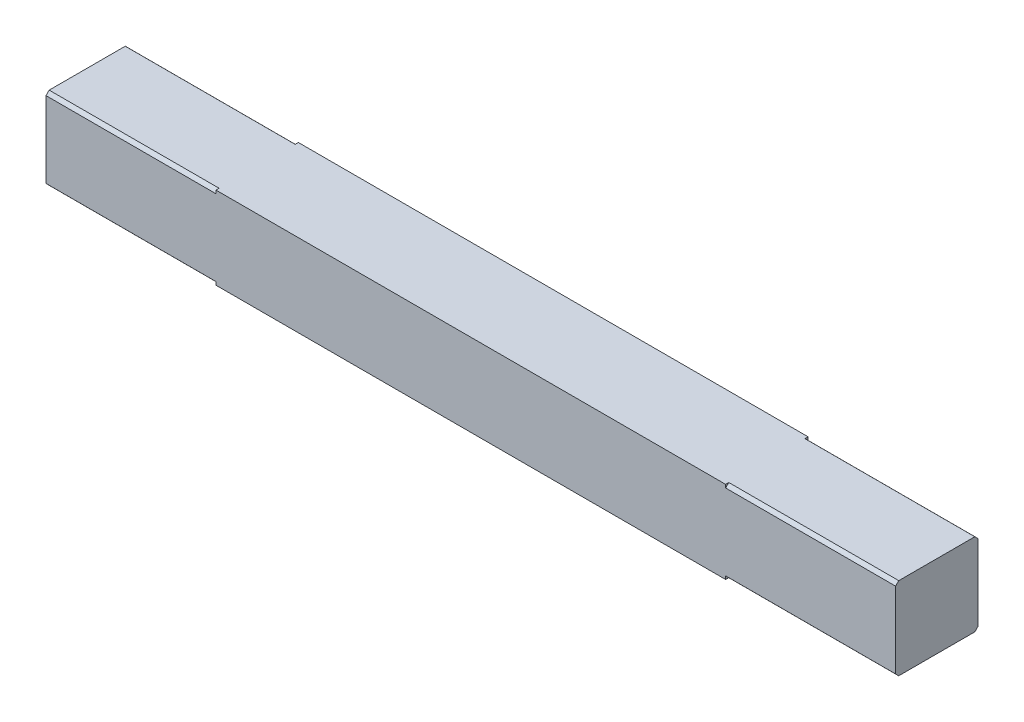
ISO-10303-21;
HEADER;
FILE_DESCRIPTION(('STEP AP214'),'2;1');
FILE_NAME('part.step','',(''),(''),'','','');
FILE_SCHEMA(('AUTOMOTIVE_DESIGN { 1 0 10303 214 1 1 1 1 }'));
ENDSEC;
DATA;
#1=APPLICATION_CONTEXT('core data for automotive mechanical design processes');
#2=APPLICATION_PROTOCOL_DEFINITION('international standard','automotive_design',2000,#1);
#3=PRODUCT_CONTEXT('',#1,'mechanical');
#4=PRODUCT('Part','Part','',(#3));
#5=PRODUCT_RELATED_PRODUCT_CATEGORY('part','',(#4));
#6=PRODUCT_DEFINITION_FORMATION('','',#4);
#7=PRODUCT_DEFINITION_CONTEXT('part definition',#1,'design');
#8=PRODUCT_DEFINITION('design','',#6,#7);
#9=PRODUCT_DEFINITION_SHAPE('','',#8);
#10=(LENGTH_UNIT() NAMED_UNIT(*) SI_UNIT(.MILLI.,.METRE.));
#11=(NAMED_UNIT(*) PLANE_ANGLE_UNIT() SI_UNIT($,.RADIAN.));
#12=(NAMED_UNIT(*) SI_UNIT($,.STERADIAN.) SOLID_ANGLE_UNIT());
#13=UNCERTAINTY_MEASURE_WITH_UNIT(LENGTH_MEASURE(1.E-05),#10,'distance_accuracy_value','');
#14=(GEOMETRIC_REPRESENTATION_CONTEXT(3) GLOBAL_UNCERTAINTY_ASSIGNED_CONTEXT((#13)) GLOBAL_UNIT_ASSIGNED_CONTEXT((#10,
#11,#12)) REPRESENTATION_CONTEXT('',''));
#15=CARTESIAN_POINT('',(0.,0.,0.));
#16=DIRECTION('',(0.,0.,1.));
#17=DIRECTION('',(1.,0.,0.));
#18=AXIS2_PLACEMENT_3D('',#15,#16,#17);
#19=CARTESIAN_POINT('',(36.4593022886911,1.27813370473538,4.85));
#20=DIRECTION('',(0.,1.,0.));
#21=DIRECTION('',(-1.,0.,0.));
#22=AXIS2_PLACEMENT_3D('',#19,#20,#21);
#23=PLANE('',#22);
#24=DIRECTION('',(0.,0.,-1.));
#25=VECTOR('',#24,1.);
#26=CARTESIAN_POINT('',(26.4593022886911,1.27813370473538,4.85));
#27=LINE('',#26,#25);
#28=CARTESIAN_POINT('',(26.4593022886911,1.27813370473538,4.85));
#29=VERTEX_POINT('',#28);
#30=CARTESIAN_POINT('',(26.4593022886911,1.27813370473538,4.66316330950179));
#31=VERTEX_POINT('',#30);
#32=EDGE_CURVE('E297',#29,#31,#27,.T.);
#33=ORIENTED_EDGE('',*,*,#32,.F.);
#34=DIRECTION('',(1.,0.,0.));
#35=VECTOR('',#34,1.);
#36=CARTESIAN_POINT('',(36.4593022886911,1.27813370473538,4.85));
#37=LINE('',#36,#35);
#38=CARTESIAN_POINT('',(-3.54069771130893,1.27813370473538,4.85));
#39=VERTEX_POINT('',#38);
#40=EDGE_CURVE('E208',#39,#29,#37,.T.);
#41=ORIENTED_EDGE('',*,*,#40,.F.);
#42=DIRECTION('',(0.,0.,1.));
#43=VECTOR('',#42,1.);
#44=CARTESIAN_POINT('',(-3.54069771130893,1.27813370473538,4.85));
#45=LINE('',#44,#43);
#46=CARTESIAN_POINT('',(-3.54069771130893,1.27813370473538,4.66316330950179));
#47=VERTEX_POINT('',#46);
#48=EDGE_CURVE('E256',#47,#39,#45,.T.);
#49=ORIENTED_EDGE('',*,*,#48,.F.);
#50=DIRECTION('',(-1.,0.,0.));
#51=VECTOR('',#50,1.);
#52=CARTESIAN_POINT('',(-3.54069771130893,1.27813370473538,4.66316330950179));
#53=LINE('',#52,#51);
#54=CARTESIAN_POINT('',(-13.5406977113089,1.27813370473538,4.66316330950179));
#55=VERTEX_POINT('',#54);
#56=EDGE_CURVE('E275',#55,#47,#53,.F.);
#57=ORIENTED_EDGE('',*,*,#56,.F.);
#58=DIRECTION('',(0.,0.,-1.));
#59=VECTOR('',#58,1.);
#60=CARTESIAN_POINT('',(-13.5406977113089,1.27813370473538,4.85));
#61=LINE('',#60,#59);
#62=CARTESIAN_POINT('',(-13.5406977113089,1.27813370473538,0.186836690498209));
#63=VERTEX_POINT('',#62);
#64=EDGE_CURVE('E224',#55,#63,#61,.T.);
#65=ORIENTED_EDGE('',*,*,#64,.T.);
#66=DIRECTION('',(-1.,0.,0.));
#67=VECTOR('',#66,1.);
#68=CARTESIAN_POINT('',(-3.54069771130893,1.27813370473538,0.186836690498209));
#69=LINE('',#68,#67);
#70=CARTESIAN_POINT('',(-3.54069771130893,1.27813370473538,0.186836690498209));
#71=VERTEX_POINT('',#70);
#72=EDGE_CURVE('E273',#71,#63,#69,.T.);
#73=ORIENTED_EDGE('',*,*,#72,.F.);
#74=CARTESIAN_POINT('',(-3.54069771130893,1.27813370473538,0.));
#75=VERTEX_POINT('',#74);
#76=EDGE_CURVE('E253',#75,#71,#45,.T.);
#77=ORIENTED_EDGE('',*,*,#76,.F.);
#78=DIRECTION('',(1.,0.,0.));
#79=VECTOR('',#78,1.);
#80=CARTESIAN_POINT('',(36.4593022886911,1.27813370473538,0.));
#81=LINE('',#80,#79);
#82=CARTESIAN_POINT('',(26.4593022886911,1.27813370473538,0.));
#83=VERTEX_POINT('',#82);
#84=EDGE_CURVE('E210',#75,#83,#81,.T.);
#85=ORIENTED_EDGE('',*,*,#84,.T.);
#86=CARTESIAN_POINT('',(26.4593022886911,1.27813370473538,0.186836690498212));
#87=VERTEX_POINT('',#86);
#88=EDGE_CURVE('E251',#87,#83,#27,.T.);
#89=ORIENTED_EDGE('',*,*,#88,.F.);
#90=DIRECTION('',(1.,0.,0.));
#91=VECTOR('',#90,1.);
#92=CARTESIAN_POINT('',(26.4593022886911,1.27813370473538,0.186836690498212));
#93=LINE('',#92,#91);
#94=CARTESIAN_POINT('',(36.4593022886911,1.27813370473538,0.18683669049821));
#95=VERTEX_POINT('',#94);
#96=EDGE_CURVE('E303',#95,#87,#93,.F.);
#97=ORIENTED_EDGE('',*,*,#96,.F.);
#98=DIRECTION('',(0.,0.,-1.));
#99=VECTOR('',#98,1.);
#100=CARTESIAN_POINT('',(36.4593022886911,1.27813370473538,4.85));
#101=LINE('',#100,#99);
#102=CARTESIAN_POINT('',(36.4593022886911,1.27813370473538,4.66316330950179));
#103=VERTEX_POINT('',#102);
#104=EDGE_CURVE('E221',#103,#95,#101,.T.);
#105=ORIENTED_EDGE('',*,*,#104,.F.);
#106=DIRECTION('',(1.,0.,0.));
#107=VECTOR('',#106,1.);
#108=CARTESIAN_POINT('',(26.4593022886911,1.27813370473538,4.66316330950179));
#109=LINE('',#108,#107);
#110=EDGE_CURVE('E50',#31,#103,#109,.T.);
#111=ORIENTED_EDGE('',*,*,#110,.F.);
#112=EDGE_LOOP('',(#33,#41,#49,#57,#65,#73,#77,#85,#89,#97,#105,#111));
#113=FACE_BOUND('',#112,.T.);
#114=ADVANCED_FACE('F35',(#113),#23,.F.);
#115=CARTESIAN_POINT('',(36.4593022886911,6.12813370473538,4.85));
#116=DIRECTION('',(0.,-1.,0.));
#117=DIRECTION('',(1.,0.,0.));
#118=AXIS2_PLACEMENT_3D('',#115,#116,#117);
#119=PLANE('',#118);
#120=DIRECTION('',(0.,0.,1.));
#121=VECTOR('',#120,1.);
#122=CARTESIAN_POINT('',(26.4593022886911,6.12813370473538,4.85));
#123=LINE('',#122,#121);
#124=CARTESIAN_POINT('',(26.4593022886911,6.12813370473538,0.));
#125=VERTEX_POINT('',#124);
#126=CARTESIAN_POINT('',(26.4593022886911,6.12813370473538,0.186836690498207));
#127=VERTEX_POINT('',#126);
#128=EDGE_CURVE('E190',#125,#127,#123,.T.);
#129=ORIENTED_EDGE('',*,*,#128,.F.);
#130=DIRECTION('',(-1.,0.,0.));
#131=VECTOR('',#130,1.);
#132=CARTESIAN_POINT('',(36.4593022886911,6.12813370473538,0.));
#133=LINE('',#132,#131);
#134=CARTESIAN_POINT('',(-3.54069771130893,6.12813370473538,0.));
#135=VERTEX_POINT('',#134);
#136=EDGE_CURVE('E197',#125,#135,#133,.T.);
#137=ORIENTED_EDGE('',*,*,#136,.T.);
#138=DIRECTION('',(0.,0.,-1.));
#139=VECTOR('',#138,1.);
#140=CARTESIAN_POINT('',(-3.54069771130893,6.12813370473538,4.85));
#141=LINE('',#140,#139);
#142=CARTESIAN_POINT('',(-3.54069771130893,6.12813370473538,0.186836690498212));
#143=VERTEX_POINT('',#142);
#144=EDGE_CURVE('E271',#143,#135,#141,.T.);
#145=ORIENTED_EDGE('',*,*,#144,.F.);
#146=DIRECTION('',(-1.,0.,0.));
#147=VECTOR('',#146,1.);
#148=CARTESIAN_POINT('',(-3.54069771130893,6.12813370473538,0.186836690498212));
#149=LINE('',#148,#147);
#150=CARTESIAN_POINT('',(-13.5406977113089,6.12813370473538,0.186836690498212));
#151=VERTEX_POINT('',#150);
#152=EDGE_CURVE('E279',#151,#143,#149,.F.);
#153=ORIENTED_EDGE('',*,*,#152,.F.);
#154=DIRECTION('',(0.,0.,-1.));
#155=VECTOR('',#154,1.);
#156=CARTESIAN_POINT('',(-13.5406977113089,6.12813370473538,4.85));
#157=LINE('',#156,#155);
#158=CARTESIAN_POINT('',(-13.5406977113089,6.12813370473538,4.66316330950179));
#159=VERTEX_POINT('',#158);
#160=EDGE_CURVE('E214',#159,#151,#157,.T.);
#161=ORIENTED_EDGE('',*,*,#160,.F.);
#162=DIRECTION('',(-1.,0.,0.));
#163=VECTOR('',#162,1.);
#164=CARTESIAN_POINT('',(-3.54069771130893,6.12813370473538,4.66316330950179));
#165=LINE('',#164,#163);
#166=CARTESIAN_POINT('',(-3.54069771130893,6.12813370473538,4.66316330950179));
#167=VERTEX_POINT('',#166);
#168=EDGE_CURVE('E277',#167,#159,#165,.T.);
#169=ORIENTED_EDGE('',*,*,#168,.F.);
#170=CARTESIAN_POINT('',(-3.54069771130893,6.12813370473538,4.85));
#171=VERTEX_POINT('',#170);
#172=EDGE_CURVE('E268',#171,#167,#141,.T.);
#173=ORIENTED_EDGE('',*,*,#172,.F.);
#174=DIRECTION('',(-1.,0.,0.));
#175=VECTOR('',#174,1.);
#176=CARTESIAN_POINT('',(36.4593022886911,6.12813370473538,4.85));
#177=LINE('',#176,#175);
#178=CARTESIAN_POINT('',(26.4593022886911,6.12813370473538,4.85));
#179=VERTEX_POINT('',#178);
#180=EDGE_CURVE('E218',#179,#171,#177,.T.);
#181=ORIENTED_EDGE('',*,*,#180,.F.);
#182=CARTESIAN_POINT('',(26.4593022886911,6.12813370473538,4.66316330950179));
#183=VERTEX_POINT('',#182);
#184=EDGE_CURVE('E300',#183,#179,#123,.T.);
#185=ORIENTED_EDGE('',*,*,#184,.F.);
#186=DIRECTION('',(1.,0.,0.));
#187=VECTOR('',#186,1.);
#188=CARTESIAN_POINT('',(26.4593022886911,6.12813370473538,4.66316330950179));
#189=LINE('',#188,#187);
#190=CARTESIAN_POINT('',(36.4593022886911,6.12813370473538,4.66316330950179));
#191=VERTEX_POINT('',#190);
#192=EDGE_CURVE('E307',#191,#183,#189,.F.);
#193=ORIENTED_EDGE('',*,*,#192,.F.);
#194=DIRECTION('',(0.,0.,-1.));
#195=VECTOR('',#194,1.);
#196=CARTESIAN_POINT('',(36.4593022886911,6.12813370473538,4.85));
#197=LINE('',#196,#195);
#198=CARTESIAN_POINT('',(36.4593022886911,6.12813370473538,0.18683669049821));
#199=VERTEX_POINT('',#198);
#200=EDGE_CURVE('E217',#191,#199,#197,.T.);
#201=ORIENTED_EDGE('',*,*,#200,.T.);
#202=DIRECTION('',(1.,0.,0.));
#203=VECTOR('',#202,1.);
#204=CARTESIAN_POINT('',(26.4593022886911,6.12813370473538,0.186836690498207));
#205=LINE('',#204,#203);
#206=EDGE_CURVE('E305',#127,#199,#205,.T.);
#207=ORIENTED_EDGE('',*,*,#206,.F.);
#208=EDGE_LOOP('',(#129,#137,#145,#153,#161,#169,#173,#181,#185,#193,#201,#207));
#209=FACE_BOUND('',#208,.T.);
#210=ADVANCED_FACE('F329',(#209),#119,.F.);
#211=CARTESIAN_POINT('',(0.,0.,4.85));
#212=DIRECTION('',(0.,0.,-1.));
#213=DIRECTION('',(-1.,0.,0.));
#214=AXIS2_PLACEMENT_3D('',#211,#212,#213);
#215=PLANE('',#214);
#216=DIRECTION('',(0.,-1.,0.));
#217=VECTOR('',#216,1.);
#218=CARTESIAN_POINT('',(26.4593022886911,0.,4.85));
#219=LINE('',#218,#217);
#220=CARTESIAN_POINT('',(26.4593022886911,5.94129701423717,4.85));
#221=VERTEX_POINT('',#220);
#222=EDGE_CURVE('E298',#179,#221,#219,.T.);
#223=ORIENTED_EDGE('',*,*,#222,.F.);
#224=ORIENTED_EDGE('',*,*,#180,.T.);
#225=DIRECTION('',(0.,1.,0.));
#226=VECTOR('',#225,1.);
#227=CARTESIAN_POINT('',(-3.54069771130893,0.,4.85));
#228=LINE('',#227,#226);
#229=CARTESIAN_POINT('',(-3.54069771130893,5.94129701423716,4.85));
#230=VERTEX_POINT('',#229);
#231=EDGE_CURVE('E265',#230,#171,#228,.T.);
#232=ORIENTED_EDGE('',*,*,#231,.F.);
#233=DIRECTION('',(-1.,0.,0.));
#234=VECTOR('',#233,1.);
#235=CARTESIAN_POINT('',(-3.54069771130893,5.94129701423716,4.85));
#236=LINE('',#235,#234);
#237=CARTESIAN_POINT('',(-13.5406977113089,5.94129701423716,4.85));
#238=VERTEX_POINT('',#237);
#239=EDGE_CURVE('E283',#238,#230,#236,.F.);
#240=ORIENTED_EDGE('',*,*,#239,.F.);
#241=DIRECTION('',(0.,-1.,0.));
#242=VECTOR('',#241,1.);
#243=CARTESIAN_POINT('',(-13.5406977113089,6.12813370473538,4.85));
#244=LINE('',#243,#242);
#245=CARTESIAN_POINT('',(-13.5406977113089,1.46497039523359,4.85));
#246=VERTEX_POINT('',#245);
#247=EDGE_CURVE('E204',#238,#246,#244,.T.);
#248=ORIENTED_EDGE('',*,*,#247,.T.);
#249=DIRECTION('',(-1.,0.,0.));
#250=VECTOR('',#249,1.);
#251=CARTESIAN_POINT('',(-3.54069771130893,1.46497039523359,4.85));
#252=LINE('',#251,#250);
#253=CARTESIAN_POINT('',(-3.54069771130893,1.46497039523359,4.85));
#254=VERTEX_POINT('',#253);
#255=EDGE_CURVE('E281',#254,#246,#252,.T.);
#256=ORIENTED_EDGE('',*,*,#255,.F.);
#257=EDGE_CURVE('E269',#39,#254,#228,.T.);
#258=ORIENTED_EDGE('',*,*,#257,.F.);
#259=ORIENTED_EDGE('',*,*,#40,.T.);
#260=CARTESIAN_POINT('',(26.4593022886911,1.46497039523359,4.85));
#261=VERTEX_POINT('',#260);
#262=EDGE_CURVE('E295',#261,#29,#219,.T.);
#263=ORIENTED_EDGE('',*,*,#262,.F.);
#264=DIRECTION('',(1.,0.,0.));
#265=VECTOR('',#264,1.);
#266=CARTESIAN_POINT('',(26.4593022886911,1.46497039523359,4.85));
#267=LINE('',#266,#265);
#268=CARTESIAN_POINT('',(36.4593022886911,1.46497039523359,4.85));
#269=VERTEX_POINT('',#268);
#270=EDGE_CURVE('E184',#269,#261,#267,.F.);
#271=ORIENTED_EDGE('',*,*,#270,.F.);
#272=DIRECTION('',(0.,1.,0.));
#273=VECTOR('',#272,1.);
#274=CARTESIAN_POINT('',(36.4593022886911,6.12813370473538,4.85));
#275=LINE('',#274,#273);
#276=CARTESIAN_POINT('',(36.4593022886911,5.94129701423717,4.85));
#277=VERTEX_POINT('',#276);
#278=EDGE_CURVE('E260',#269,#277,#275,.T.);
#279=ORIENTED_EDGE('',*,*,#278,.T.);
#280=DIRECTION('',(1.,0.,0.));
#281=VECTOR('',#280,1.);
#282=CARTESIAN_POINT('',(26.4593022886911,5.94129701423717,4.85));
#283=LINE('',#282,#281);
#284=EDGE_CURVE('E58',#221,#277,#283,.T.);
#285=ORIENTED_EDGE('',*,*,#284,.F.);
#286=EDGE_LOOP('',(#223,#224,#232,#240,#248,#256,#258,#259,#263,#271,#279,#285));
#287=FACE_BOUND('',#286,.T.);
#288=ADVANCED_FACE('F323',(#287),#215,.F.);
#289=CARTESIAN_POINT('',(0.,0.,0.));
#290=DIRECTION('',(0.,0.,-1.));
#291=DIRECTION('',(-1.,0.,0.));
#292=AXIS2_PLACEMENT_3D('',#289,#290,#291);
#293=PLANE('',#292);
#294=ORIENTED_EDGE('',*,*,#136,.F.);
#295=DIRECTION('',(0.,-1.,0.));
#296=VECTOR('',#295,1.);
#297=CARTESIAN_POINT('',(26.4593022886911,0.,0.));
#298=LINE('',#297,#296);
#299=CARTESIAN_POINT('',(26.4593022886911,5.94129701423717,0.));
#300=VERTEX_POINT('',#299);
#301=EDGE_CURVE('E12',#125,#300,#298,.T.);
#302=ORIENTED_EDGE('',*,*,#301,.T.);
#303=DIRECTION('',(1.,0.,0.));
#304=VECTOR('',#303,1.);
#305=CARTESIAN_POINT('',(26.4593022886911,5.94129701423717,0.));
#306=LINE('',#305,#304);
#307=CARTESIAN_POINT('',(36.4593022886911,5.94129701423717,0.));
#308=VERTEX_POINT('',#307);
#309=EDGE_CURVE('E174',#300,#308,#306,.T.);
#310=ORIENTED_EDGE('',*,*,#309,.T.);
#311=DIRECTION('',(0.,1.,0.));
#312=VECTOR('',#311,1.);
#313=CARTESIAN_POINT('',(36.4593022886911,6.12813370473538,0.));
#314=LINE('',#313,#312);
#315=CARTESIAN_POINT('',(36.4593022886911,1.46497039523359,0.));
#316=VERTEX_POINT('',#315);
#317=EDGE_CURVE('E205',#316,#308,#314,.T.);
#318=ORIENTED_EDGE('',*,*,#317,.F.);
#319=DIRECTION('',(1.,0.,0.));
#320=VECTOR('',#319,1.);
#321=CARTESIAN_POINT('',(26.4593022886911,1.46497039523359,0.));
#322=LINE('',#321,#320);
#323=CARTESIAN_POINT('',(26.4593022886911,1.46497039523359,0.));
#324=VERTEX_POINT('',#323);
#325=EDGE_CURVE('E185',#316,#324,#322,.F.);
#326=ORIENTED_EDGE('',*,*,#325,.T.);
#327=EDGE_CURVE('E39',#324,#83,#298,.T.);
#328=ORIENTED_EDGE('',*,*,#327,.T.);
#329=ORIENTED_EDGE('',*,*,#84,.F.);
#330=DIRECTION('',(0.,1.,0.));
#331=VECTOR('',#330,1.);
#332=CARTESIAN_POINT('',(-3.54069771130893,0.,0.));
#333=LINE('',#332,#331);
#334=CARTESIAN_POINT('',(-3.54069771130893,1.46497039523359,0.));
#335=VERTEX_POINT('',#334);
#336=EDGE_CURVE('E231',#75,#335,#333,.T.);
#337=ORIENTED_EDGE('',*,*,#336,.T.);
#338=DIRECTION('',(-1.,0.,0.));
#339=VECTOR('',#338,1.);
#340=CARTESIAN_POINT('',(-3.54069771130893,1.46497039523359,0.));
#341=LINE('',#340,#339);
#342=CARTESIAN_POINT('',(-13.5406977113089,1.46497039523359,0.));
#343=VERTEX_POINT('',#342);
#344=EDGE_CURVE('E230',#335,#343,#341,.T.);
#345=ORIENTED_EDGE('',*,*,#344,.T.);
#346=DIRECTION('',(0.,-1.,0.));
#347=VECTOR('',#346,1.);
#348=CARTESIAN_POINT('',(-13.5406977113089,6.12813370473538,0.));
#349=LINE('',#348,#347);
#350=CARTESIAN_POINT('',(-13.5406977113089,5.94129701423716,0.));
#351=VERTEX_POINT('',#350);
#352=EDGE_CURVE('E254',#351,#343,#349,.T.);
#353=ORIENTED_EDGE('',*,*,#352,.F.);
#354=DIRECTION('',(-1.,0.,0.));
#355=VECTOR('',#354,1.);
#356=CARTESIAN_POINT('',(-3.54069771130893,5.94129701423716,0.));
#357=LINE('',#356,#355);
#358=CARTESIAN_POINT('',(-3.54069771130893,5.94129701423716,0.));
#359=VERTEX_POINT('',#358);
#360=EDGE_CURVE('E227',#351,#359,#357,.F.);
#361=ORIENTED_EDGE('',*,*,#360,.T.);
#362=EDGE_CURVE('E200',#359,#135,#333,.T.);
#363=ORIENTED_EDGE('',*,*,#362,.T.);
#364=EDGE_LOOP('',(#294,#302,#310,#318,#326,#328,#329,#337,#345,#353,#361,#363));
#365=FACE_BOUND('',#364,.T.);
#366=ADVANCED_FACE('F195',(#365),#293,.T.);
#367=CARTESIAN_POINT('',(36.4593022886911,6.12813370473538,4.85));
#368=DIRECTION('',(-1.,0.,0.));
#369=DIRECTION('',(0.,0.,1.));
#370=AXIS2_PLACEMENT_3D('',#367,#368,#369);
#371=PLANE('',#370);
#372=CARTESIAN_POINT('',(36.4593022886911,3.70313370473538,2.425));
#373=DIRECTION('',(-1.,0.,0.));
#374=DIRECTION('',(0.,0.,1.));
#375=AXIS2_PLACEMENT_3D('',#372,#373,#374);
#376=CIRCLE('',#375,3.3);
#377=EDGE_CURVE('E235',#277,#191,#376,.T.);
#378=ORIENTED_EDGE('',*,*,#377,.F.);
#379=ORIENTED_EDGE('',*,*,#278,.F.);
#380=EDGE_CURVE('E233',#103,#269,#376,.T.);
#381=ORIENTED_EDGE('',*,*,#380,.F.);
#382=ORIENTED_EDGE('',*,*,#104,.T.);
#383=EDGE_CURVE('E234',#316,#95,#376,.T.);
#384=ORIENTED_EDGE('',*,*,#383,.F.);
#385=ORIENTED_EDGE('',*,*,#317,.T.);
#386=CARTESIAN_POINT('',(36.4593022886911,3.70313370473538,2.425));
#387=DIRECTION('',(1.,0.,0.));
#388=DIRECTION('',(0.,0.,-1.));
#389=AXIS2_PLACEMENT_3D('',#386,#387,#388);
#390=CIRCLE('',#389,3.3);
#391=EDGE_CURVE('E180',#308,#199,#390,.T.);
#392=ORIENTED_EDGE('',*,*,#391,.T.);
#393=ORIENTED_EDGE('',*,*,#200,.F.);
#394=EDGE_LOOP('',(#378,#379,#381,#382,#384,#385,#392,#393));
#395=FACE_BOUND('',#394,.T.);
#396=ADVANCED_FACE('F327',(#395),#371,.F.);
#397=CARTESIAN_POINT('',(-13.5406977113089,6.12813370473538,4.85));
#398=DIRECTION('',(1.,0.,0.));
#399=DIRECTION('',(0.,0.,-1.));
#400=AXIS2_PLACEMENT_3D('',#397,#398,#399);
#401=PLANE('',#400);
#402=CARTESIAN_POINT('',(-13.5406977113089,3.70313370473538,2.425));
#403=DIRECTION('',(-1.,0.,0.));
#404=DIRECTION('',(0.,0.,1.));
#405=AXIS2_PLACEMENT_3D('',#402,#403,#404);
#406=CIRCLE('',#405,3.3);
#407=EDGE_CURVE('E290',#151,#351,#406,.T.);
#408=ORIENTED_EDGE('',*,*,#407,.T.);
#409=ORIENTED_EDGE('',*,*,#352,.T.);
#410=EDGE_CURVE('E332',#343,#63,#406,.T.);
#411=ORIENTED_EDGE('',*,*,#410,.T.);
#412=ORIENTED_EDGE('',*,*,#64,.F.);
#413=EDGE_CURVE('E291',#55,#246,#406,.T.);
#414=ORIENTED_EDGE('',*,*,#413,.T.);
#415=ORIENTED_EDGE('',*,*,#247,.F.);
#416=EDGE_CURVE('E286',#238,#159,#406,.T.);
#417=ORIENTED_EDGE('',*,*,#416,.T.);
#418=ORIENTED_EDGE('',*,*,#160,.T.);
#419=EDGE_LOOP('',(#408,#409,#411,#412,#414,#415,#417,#418));
#420=FACE_BOUND('',#419,.T.);
#421=ADVANCED_FACE('F37',(#420),#401,.F.);
#422=CARTESIAN_POINT('',(-3.54069771130893,3.70313370473538,2.425));
#423=DIRECTION('',(-1.,0.,0.));
#424=DIRECTION('',(0.,0.,1.));
#425=AXIS2_PLACEMENT_3D('',#422,#423,#424);
#426=CYLINDRICAL_SURFACE('',#425,3.3);
#427=ORIENTED_EDGE('',*,*,#152,.T.);
#428=CARTESIAN_POINT('',(-3.54069771130893,3.70313370473538,2.425));
#429=DIRECTION('',(-1.,0.,0.));
#430=DIRECTION('',(0.,0.,1.));
#431=AXIS2_PLACEMENT_3D('',#428,#429,#430);
#432=CIRCLE('',#431,3.3);
#433=EDGE_CURVE('E294',#143,#359,#432,.T.);
#434=ORIENTED_EDGE('',*,*,#433,.T.);
#435=ORIENTED_EDGE('',*,*,#360,.F.);
#436=ORIENTED_EDGE('',*,*,#407,.F.);
#437=EDGE_LOOP('',(#427,#434,#435,#436));
#438=FACE_BOUND('',#437,.T.);
#439=ADVANCED_FACE('F368',(#438),#426,.T.);
#440=CARTESIAN_POINT('',(-3.54069771130893,3.70313370473538,2.425));
#441=DIRECTION('',(-1.,0.,0.));
#442=DIRECTION('',(0.,0.,1.));
#443=AXIS2_PLACEMENT_3D('',#440,#441,#442);
#444=PLANE('',#443);
#445=ORIENTED_EDGE('',*,*,#144,.T.);
#446=ORIENTED_EDGE('',*,*,#362,.F.);
#447=ORIENTED_EDGE('',*,*,#433,.F.);
#448=EDGE_LOOP('',(#445,#446,#447));
#449=FACE_BOUND('',#448,.T.);
#450=ADVANCED_FACE('F370',(#449),#444,.T.);
#451=ORIENTED_EDGE('',*,*,#72,.T.);
#452=ORIENTED_EDGE('',*,*,#410,.F.);
#453=ORIENTED_EDGE('',*,*,#344,.F.);
#454=EDGE_CURVE('E362',#335,#71,#432,.T.);
#455=ORIENTED_EDGE('',*,*,#454,.T.);
#456=EDGE_LOOP('',(#451,#452,#453,#455));
#457=FACE_BOUND('',#456,.T.);
#458=ADVANCED_FACE('F371',(#457),#426,.T.);
#459=ORIENTED_EDGE('',*,*,#76,.T.);
#460=ORIENTED_EDGE('',*,*,#454,.F.);
#461=ORIENTED_EDGE('',*,*,#336,.F.);
#462=EDGE_LOOP('',(#459,#460,#461));
#463=FACE_BOUND('',#462,.T.);
#464=ADVANCED_FACE('F373',(#463),#444,.T.);
#465=ORIENTED_EDGE('',*,*,#168,.T.);
#466=ORIENTED_EDGE('',*,*,#416,.F.);
#467=ORIENTED_EDGE('',*,*,#239,.T.);
#468=EDGE_CURVE('E285',#230,#167,#432,.T.);
#469=ORIENTED_EDGE('',*,*,#468,.T.);
#470=EDGE_LOOP('',(#465,#466,#467,#469));
#471=FACE_BOUND('',#470,.T.);
#472=ADVANCED_FACE('F348',(#471),#426,.T.);
#473=ORIENTED_EDGE('',*,*,#172,.T.);
#474=ORIENTED_EDGE('',*,*,#468,.F.);
#475=ORIENTED_EDGE('',*,*,#231,.T.);
#476=EDGE_LOOP('',(#473,#474,#475));
#477=FACE_BOUND('',#476,.T.);
#478=ADVANCED_FACE('F344',(#477),#444,.T.);
#479=ORIENTED_EDGE('',*,*,#48,.T.);
#480=ORIENTED_EDGE('',*,*,#257,.T.);
#481=EDGE_CURVE('E289',#47,#254,#432,.T.);
#482=ORIENTED_EDGE('',*,*,#481,.F.);
#483=EDGE_LOOP('',(#479,#480,#482));
#484=FACE_BOUND('',#483,.T.);
#485=ADVANCED_FACE('F361',(#484),#444,.T.);
#486=ORIENTED_EDGE('',*,*,#56,.T.);
#487=ORIENTED_EDGE('',*,*,#481,.T.);
#488=ORIENTED_EDGE('',*,*,#255,.T.);
#489=ORIENTED_EDGE('',*,*,#413,.F.);
#490=EDGE_LOOP('',(#486,#487,#488,#489));
#491=FACE_BOUND('',#490,.T.);
#492=ADVANCED_FACE('F360',(#491),#426,.T.);
#493=CARTESIAN_POINT('',(26.4593022886911,3.70313370473538,2.425));
#494=DIRECTION('',(1.,0.,0.));
#495=DIRECTION('',(0.,0.,-1.));
#496=AXIS2_PLACEMENT_3D('',#493,#494,#495);
#497=CYLINDRICAL_SURFACE('',#496,3.3);
#498=ORIENTED_EDGE('',*,*,#110,.T.);
#499=ORIENTED_EDGE('',*,*,#380,.T.);
#500=ORIENTED_EDGE('',*,*,#270,.T.);
#501=CARTESIAN_POINT('',(26.4593022886911,3.70313370473538,2.425));
#502=DIRECTION('',(1.,0.,0.));
#503=DIRECTION('',(0.,0.,-1.));
#504=AXIS2_PLACEMENT_3D('',#501,#502,#503);
#505=CIRCLE('',#504,3.3);
#506=EDGE_CURVE('E314',#261,#31,#505,.T.);
#507=ORIENTED_EDGE('',*,*,#506,.T.);
#508=EDGE_LOOP('',(#498,#499,#500,#507));
#509=FACE_BOUND('',#508,.T.);
#510=ADVANCED_FACE('F411',(#509),#497,.T.);
#511=CARTESIAN_POINT('',(26.4593022886911,3.70313370473538,2.425));
#512=DIRECTION('',(1.,0.,0.));
#513=DIRECTION('',(0.,0.,-1.));
#514=AXIS2_PLACEMENT_3D('',#511,#512,#513);
#515=PLANE('',#514);
#516=ORIENTED_EDGE('',*,*,#32,.T.);
#517=ORIENTED_EDGE('',*,*,#506,.F.);
#518=ORIENTED_EDGE('',*,*,#262,.T.);
#519=EDGE_LOOP('',(#516,#517,#518));
#520=FACE_BOUND('',#519,.T.);
#521=ADVANCED_FACE('F334',(#520),#515,.T.);
#522=ORIENTED_EDGE('',*,*,#96,.T.);
#523=EDGE_CURVE('E193',#87,#324,#505,.T.);
#524=ORIENTED_EDGE('',*,*,#523,.T.);
#525=ORIENTED_EDGE('',*,*,#325,.F.);
#526=ORIENTED_EDGE('',*,*,#383,.T.);
#527=EDGE_LOOP('',(#522,#524,#525,#526));
#528=FACE_BOUND('',#527,.T.);
#529=ADVANCED_FACE('F417',(#528),#497,.T.);
#530=ORIENTED_EDGE('',*,*,#88,.T.);
#531=ORIENTED_EDGE('',*,*,#327,.F.);
#532=ORIENTED_EDGE('',*,*,#523,.F.);
#533=EDGE_LOOP('',(#530,#531,#532));
#534=FACE_BOUND('',#533,.T.);
#535=ADVANCED_FACE('F436',(#534),#515,.T.);
#536=ORIENTED_EDGE('',*,*,#206,.T.);
#537=ORIENTED_EDGE('',*,*,#391,.F.);
#538=ORIENTED_EDGE('',*,*,#309,.F.);
#539=EDGE_CURVE('E177',#300,#127,#505,.T.);
#540=ORIENTED_EDGE('',*,*,#539,.T.);
#541=EDGE_LOOP('',(#536,#537,#538,#540));
#542=FACE_BOUND('',#541,.T.);
#543=ADVANCED_FACE('F176',(#542),#497,.T.);
#544=ORIENTED_EDGE('',*,*,#128,.T.);
#545=ORIENTED_EDGE('',*,*,#539,.F.);
#546=ORIENTED_EDGE('',*,*,#301,.F.);
#547=EDGE_LOOP('',(#544,#545,#546));
#548=FACE_BOUND('',#547,.T.);
#549=ADVANCED_FACE('F188',(#548),#515,.T.);
#550=ORIENTED_EDGE('',*,*,#184,.T.);
#551=ORIENTED_EDGE('',*,*,#222,.T.);
#552=EDGE_CURVE('E191',#183,#221,#505,.T.);
#553=ORIENTED_EDGE('',*,*,#552,.F.);
#554=EDGE_LOOP('',(#550,#551,#553));
#555=FACE_BOUND('',#554,.T.);
#556=ADVANCED_FACE('F428',(#555),#515,.T.);
#557=ORIENTED_EDGE('',*,*,#192,.T.);
#558=ORIENTED_EDGE('',*,*,#552,.T.);
#559=ORIENTED_EDGE('',*,*,#284,.T.);
#560=ORIENTED_EDGE('',*,*,#377,.T.);
#561=EDGE_LOOP('',(#557,#558,#559,#560));
#562=FACE_BOUND('',#561,.T.);
#563=ADVANCED_FACE('F318',(#562),#497,.T.);
#564=CLOSED_SHELL('',(#114,#210,#288,#366,#396,#421,#439,#450,#458,#464,#472,#478,#485,#492,
#510,#521,#529,#535,#543,#549,#556,#563));
#565=MANIFOLD_SOLID_BREP('B2',#564);
#566=ADVANCED_BREP_SHAPE_REPRESENTATION('',(#18,#565),#14);
#567=SHAPE_DEFINITION_REPRESENTATION(#9,#566);
ENDSEC;
END-ISO-10303-21;
